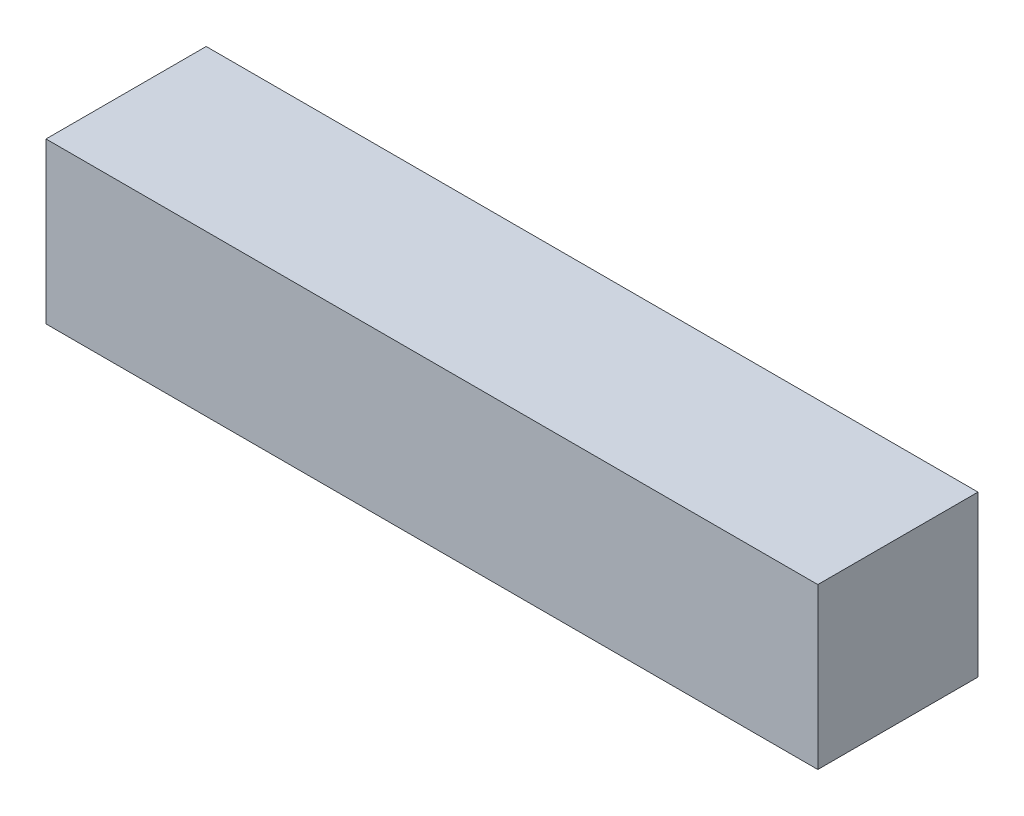
ISO-10303-21;
HEADER;
FILE_DESCRIPTION(('STEP AP214'),'2;1');
FILE_NAME('part.step','',(''),(''),'','','');
FILE_SCHEMA(('AUTOMOTIVE_DESIGN { 1 0 10303 214 1 1 1 1 }'));
ENDSEC;
DATA;
#1=APPLICATION_CONTEXT('core data for automotive mechanical design processes');
#2=APPLICATION_PROTOCOL_DEFINITION('international standard','automotive_design',2000,#1);
#3=PRODUCT_CONTEXT('',#1,'mechanical');
#4=PRODUCT('Part','Part','',(#3));
#5=PRODUCT_RELATED_PRODUCT_CATEGORY('part','',(#4));
#6=PRODUCT_DEFINITION_FORMATION('','',#4);
#7=PRODUCT_DEFINITION_CONTEXT('part definition',#1,'design');
#8=PRODUCT_DEFINITION('design','',#6,#7);
#9=PRODUCT_DEFINITION_SHAPE('','',#8);
#10=(LENGTH_UNIT() NAMED_UNIT(*) SI_UNIT(.MILLI.,.METRE.));
#11=(NAMED_UNIT(*) PLANE_ANGLE_UNIT() SI_UNIT($,.RADIAN.));
#12=(NAMED_UNIT(*) SI_UNIT($,.STERADIAN.) SOLID_ANGLE_UNIT());
#13=UNCERTAINTY_MEASURE_WITH_UNIT(LENGTH_MEASURE(1.E-05),#10,'distance_accuracy_value','');
#14=(GEOMETRIC_REPRESENTATION_CONTEXT(3) GLOBAL_UNCERTAINTY_ASSIGNED_CONTEXT((#13)) GLOBAL_UNIT_ASSIGNED_CONTEXT((#10,
#11,#12)) REPRESENTATION_CONTEXT('',''));
#15=CARTESIAN_POINT('',(0.,0.,0.));
#16=DIRECTION('',(0.,0.,1.));
#17=DIRECTION('',(1.,0.,0.));
#18=AXIS2_PLACEMENT_3D('',#15,#16,#17);
#19=CARTESIAN_POINT('',(-53.,0.,11.));
#20=DIRECTION('',(0.,0.,1.));
#21=DIRECTION('',(1.,0.,0.));
#22=AXIS2_PLACEMENT_3D('',#19,#20,#21);
#23=PLANE('',#22);
#24=DIRECTION('',(1.,0.,0.));
#25=VECTOR('',#24,1.);
#26=CARTESIAN_POINT('',(-53.,0.,11.));
#27=LINE('',#26,#25);
#28=CARTESIAN_POINT('',(-53.,0.,11.));
#29=VERTEX_POINT('',#28);
#30=CARTESIAN_POINT('',(53.,0.,11.));
#31=VERTEX_POINT('',#30);
#32=EDGE_CURVE('E11',#29,#31,#27,.T.);
#33=ORIENTED_EDGE('',*,*,#32,.T.);
#34=DIRECTION('',(0.,1.,0.));
#35=VECTOR('',#34,1.);
#36=CARTESIAN_POINT('',(53.,0.,11.));
#37=LINE('',#36,#35);
#38=CARTESIAN_POINT('',(53.,22.,11.));
#39=VERTEX_POINT('',#38);
#40=EDGE_CURVE('E26',#31,#39,#37,.T.);
#41=ORIENTED_EDGE('',*,*,#40,.T.);
#42=DIRECTION('',(1.,0.,0.));
#43=VECTOR('',#42,1.);
#44=CARTESIAN_POINT('',(-53.,22.,11.));
#45=LINE('',#44,#43);
#46=CARTESIAN_POINT('',(-53.,22.,11.));
#47=VERTEX_POINT('',#46);
#48=EDGE_CURVE('E105',#47,#39,#45,.T.);
#49=ORIENTED_EDGE('',*,*,#48,.F.);
#50=DIRECTION('',(0.,1.,0.));
#51=VECTOR('',#50,1.);
#52=CARTESIAN_POINT('',(-53.,0.,11.));
#53=LINE('',#52,#51);
#54=EDGE_CURVE('E85',#29,#47,#53,.T.);
#55=ORIENTED_EDGE('',*,*,#54,.F.);
#56=EDGE_LOOP('',(#33,#41,#49,#55));
#57=FACE_BOUND('',#56,.T.);
#58=ADVANCED_FACE('F16',(#57),#23,.T.);
#59=CARTESIAN_POINT('',(-53.,0.,-11.));
#60=DIRECTION('',(-1.,0.,0.));
#61=DIRECTION('',(0.,0.,1.));
#62=AXIS2_PLACEMENT_3D('',#59,#60,#61);
#63=PLANE('',#62);
#64=DIRECTION('',(0.,0.,1.));
#65=VECTOR('',#64,1.);
#66=CARTESIAN_POINT('',(-53.,0.,-11.));
#67=LINE('',#66,#65);
#68=CARTESIAN_POINT('',(-53.,0.,-11.));
#69=VERTEX_POINT('',#68);
#70=EDGE_CURVE('E19',#69,#29,#67,.T.);
#71=ORIENTED_EDGE('',*,*,#70,.T.);
#72=ORIENTED_EDGE('',*,*,#54,.T.);
#73=DIRECTION('',(0.,0.,1.));
#74=VECTOR('',#73,1.);
#75=CARTESIAN_POINT('',(-53.,22.,-11.));
#76=LINE('',#75,#74);
#77=CARTESIAN_POINT('',(-53.,22.,-11.));
#78=VERTEX_POINT('',#77);
#79=EDGE_CURVE('E97',#78,#47,#76,.T.);
#80=ORIENTED_EDGE('',*,*,#79,.F.);
#81=DIRECTION('',(0.,1.,0.));
#82=VECTOR('',#81,1.);
#83=CARTESIAN_POINT('',(-53.,0.,-11.));
#84=LINE('',#83,#82);
#85=EDGE_CURVE('E86',#69,#78,#84,.T.);
#86=ORIENTED_EDGE('',*,*,#85,.F.);
#87=EDGE_LOOP('',(#71,#72,#80,#86));
#88=FACE_BOUND('',#87,.T.);
#89=ADVANCED_FACE('F118',(#88),#63,.T.);
#90=CARTESIAN_POINT('',(53.,0.,-11.));
#91=DIRECTION('',(0.,0.,-1.));
#92=DIRECTION('',(0.,-1.,0.));
#93=AXIS2_PLACEMENT_3D('',#90,#91,#92);
#94=PLANE('',#93);
#95=DIRECTION('',(-1.,0.,0.));
#96=VECTOR('',#95,1.);
#97=CARTESIAN_POINT('',(53.,0.,-11.));
#98=LINE('',#97,#96);
#99=CARTESIAN_POINT('',(53.,0.,-11.));
#100=VERTEX_POINT('',#99);
#101=EDGE_CURVE('E72',#100,#69,#98,.T.);
#102=ORIENTED_EDGE('',*,*,#101,.T.);
#103=ORIENTED_EDGE('',*,*,#85,.T.);
#104=DIRECTION('',(-1.,0.,0.));
#105=VECTOR('',#104,1.);
#106=CARTESIAN_POINT('',(53.,22.,-11.));
#107=LINE('',#106,#105);
#108=CARTESIAN_POINT('',(53.,22.,-11.));
#109=VERTEX_POINT('',#108);
#110=EDGE_CURVE('E63',#109,#78,#107,.T.);
#111=ORIENTED_EDGE('',*,*,#110,.F.);
#112=DIRECTION('',(0.,1.,0.));
#113=VECTOR('',#112,1.);
#114=CARTESIAN_POINT('',(53.,0.,-11.));
#115=LINE('',#114,#113);
#116=EDGE_CURVE('E69',#100,#109,#115,.T.);
#117=ORIENTED_EDGE('',*,*,#116,.F.);
#118=EDGE_LOOP('',(#102,#103,#111,#117));
#119=FACE_BOUND('',#118,.T.);
#120=ADVANCED_FACE('F71',(#119),#94,.T.);
#121=CARTESIAN_POINT('',(53.,0.,11.));
#122=DIRECTION('',(1.,0.,0.));
#123=DIRECTION('',(0.,1.,0.));
#124=AXIS2_PLACEMENT_3D('',#121,#122,#123);
#125=PLANE('',#124);
#126=DIRECTION('',(0.,0.,-1.));
#127=VECTOR('',#126,1.);
#128=CARTESIAN_POINT('',(53.,0.,11.));
#129=LINE('',#128,#127);
#130=EDGE_CURVE('E75',#31,#100,#129,.T.);
#131=ORIENTED_EDGE('',*,*,#130,.T.);
#132=ORIENTED_EDGE('',*,*,#116,.T.);
#133=DIRECTION('',(0.,0.,-1.));
#134=VECTOR('',#133,1.);
#135=CARTESIAN_POINT('',(53.,22.,11.));
#136=LINE('',#135,#134);
#137=EDGE_CURVE('E76',#39,#109,#136,.T.);
#138=ORIENTED_EDGE('',*,*,#137,.F.);
#139=ORIENTED_EDGE('',*,*,#40,.F.);
#140=EDGE_LOOP('',(#131,#132,#138,#139));
#141=FACE_BOUND('',#140,.T.);
#142=ADVANCED_FACE('F88',(#141),#125,.T.);
#143=CARTESIAN_POINT('',(0.,22.,0.));
#144=DIRECTION('',(0.,1.,0.));
#145=DIRECTION('',(1.,0.,0.));
#146=AXIS2_PLACEMENT_3D('',#143,#144,#145);
#147=PLANE('',#146);
#148=ORIENTED_EDGE('',*,*,#137,.T.);
#149=ORIENTED_EDGE('',*,*,#110,.T.);
#150=ORIENTED_EDGE('',*,*,#79,.T.);
#151=ORIENTED_EDGE('',*,*,#48,.T.);
#152=EDGE_LOOP('',(#148,#149,#150,#151));
#153=FACE_BOUND('',#152,.T.);
#154=ADVANCED_FACE('F114',(#153),#147,.T.);
#155=CARTESIAN_POINT('',(0.,0.,0.));
#156=DIRECTION('',(0.,1.,0.));
#157=DIRECTION('',(1.,0.,0.));
#158=AXIS2_PLACEMENT_3D('',#155,#156,#157);
#159=PLANE('',#158);
#160=ORIENTED_EDGE('',*,*,#130,.F.);
#161=ORIENTED_EDGE('',*,*,#32,.F.);
#162=ORIENTED_EDGE('',*,*,#70,.F.);
#163=ORIENTED_EDGE('',*,*,#101,.F.);
#164=EDGE_LOOP('',(#160,#161,#162,#163));
#165=FACE_BOUND('',#164,.T.);
#166=ADVANCED_FACE('F81',(#165),#159,.F.);
#167=CLOSED_SHELL('',(#58,#89,#120,#142,#154,#166));
#168=MANIFOLD_SOLID_BREP('B1',#167);
#169=ADVANCED_BREP_SHAPE_REPRESENTATION('',(#18,#168),#14);
#170=SHAPE_DEFINITION_REPRESENTATION(#9,#169);
ENDSEC;
END-ISO-10303-21;
